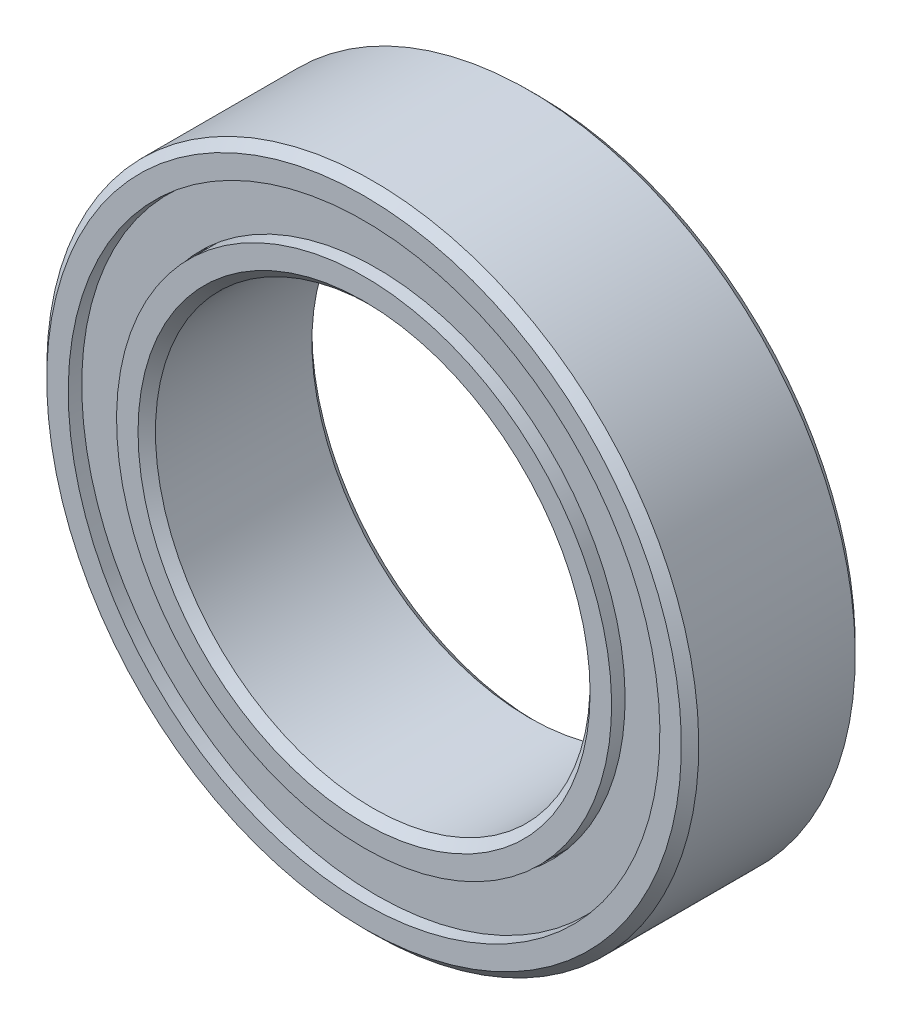
ISO-10303-21;
HEADER;
FILE_DESCRIPTION(('STEP AP214'),'2;1');
FILE_NAME('part.step','',(''),(''),'','','');
FILE_SCHEMA(('AUTOMOTIVE_DESIGN { 1 0 10303 214 1 1 1 1 }'));
ENDSEC;
DATA;
#1=APPLICATION_CONTEXT('core data for automotive mechanical design processes');
#2=APPLICATION_PROTOCOL_DEFINITION('international standard','automotive_design',2000,#1);
#3=PRODUCT_CONTEXT('',#1,'mechanical');
#4=PRODUCT('Part','Part','',(#3));
#5=PRODUCT_RELATED_PRODUCT_CATEGORY('part','',(#4));
#6=PRODUCT_DEFINITION_FORMATION('','',#4);
#7=PRODUCT_DEFINITION_CONTEXT('part definition',#1,'design');
#8=PRODUCT_DEFINITION('design','',#6,#7);
#9=PRODUCT_DEFINITION_SHAPE('','',#8);
#10=(LENGTH_UNIT() NAMED_UNIT(*) SI_UNIT(.MILLI.,.METRE.));
#11=(NAMED_UNIT(*) PLANE_ANGLE_UNIT() SI_UNIT($,.RADIAN.));
#12=(NAMED_UNIT(*) SI_UNIT($,.STERADIAN.) SOLID_ANGLE_UNIT());
#13=UNCERTAINTY_MEASURE_WITH_UNIT(LENGTH_MEASURE(1.E-05),#10,'distance_accuracy_value','');
#14=(GEOMETRIC_REPRESENTATION_CONTEXT(3) GLOBAL_UNCERTAINTY_ASSIGNED_CONTEXT((#13)) GLOBAL_UNIT_ASSIGNED_CONTEXT((#10,
#11,#12)) REPRESENTATION_CONTEXT('',''));
#15=CARTESIAN_POINT('',(0.,0.,0.));
#16=DIRECTION('',(0.,0.,1.));
#17=DIRECTION('',(1.,0.,0.));
#18=AXIS2_PLACEMENT_3D('',#15,#16,#17);
#19=CARTESIAN_POINT('',(3.37900510909742,5.25783458019492,0.));
#20=DIRECTION('',(0.,0.,1.));
#21=DIRECTION('',(0.540640817455587,0.841253532831188,0.));
#22=AXIS2_PLACEMENT_3D('',#19,#20,#21);
#23=SPHERICAL_SURFACE('',#22,1.04822012578407);
#24=CARTESIAN_POINT('',(3.37900510909742,5.25783458019492,1.04822012578406));
#25=VERTEX_POINT('',#24);
#26=VERTEX_LOOP('',#25);
#27=FACE_BOUND('',#26,.T.);
#28=ADVANCED_FACE('F46',(#27),#23,.T.);
#29=CLOSED_SHELL('',(#28));
#30=MANIFOLD_SOLID_BREP('B2',#29);
#31=CARTESIAN_POINT('',(5.68519997096571,2.59634383126185,0.));
#32=DIRECTION('',(0.,0.,1.));
#33=DIRECTION('',(0.909631995354514,0.415415013001897,0.));
#34=AXIS2_PLACEMENT_3D('',#31,#32,#33);
#35=SPHERICAL_SURFACE('',#34,1.04822012578407);
#36=CARTESIAN_POINT('',(5.68519997096571,2.59634383126185,1.04822012578406));
#37=VERTEX_POINT('',#36);
#38=VERTEX_LOOP('',#37);
#39=FACE_BOUND('',#38,.T.);
#40=ADVANCED_FACE('F66',(#39),#35,.T.);
#41=CLOSED_SHELL('',(#40));
#42=MANIFOLD_SOLID_BREP('B6',#41);
#43=CARTESIAN_POINT('',(6.18638401175584,-0.889467739207972,0.));
#44=DIRECTION('',(0.,0.,1.));
#45=DIRECTION('',(0.989821441880934,-0.142314838273276,0.));
#46=AXIS2_PLACEMENT_3D('',#43,#44,#45);
#47=SPHERICAL_SURFACE('',#46,1.04822012578407);
#48=CARTESIAN_POINT('',(6.18638401175584,-0.889467739207972,1.04822012578406));
#49=VERTEX_POINT('',#48);
#50=VERTEX_LOOP('',#49);
#51=FACE_BOUND('',#50,.T.);
#52=ADVANCED_FACE('F85',(#51),#47,.T.);
#53=CLOSED_SHELL('',(#52));
#54=MANIFOLD_SOLID_BREP('B42',#53);
#55=CARTESIAN_POINT('',(4.72343483971415,-4.09287958715799,0.));
#56=DIRECTION('',(0.,0.,1.));
#57=DIRECTION('',(0.755749574354264,-0.654860733945279,0.));
#58=AXIS2_PLACEMENT_3D('',#55,#56,#57);
#59=SPHERICAL_SURFACE('',#58,1.04822012578407);
#60=CARTESIAN_POINT('',(4.72343483971415,-4.09287958715799,1.04822012578406));
#61=VERTEX_POINT('',#60);
#62=VERTEX_LOOP('',#61);
#63=FACE_BOUND('',#62,.T.);
#64=ADVANCED_FACE('F105',(#63),#59,.T.);
#65=CLOSED_SHELL('',(#64));
#66=MANIFOLD_SOLID_BREP('B62',#65);
#67=CARTESIAN_POINT('',(1.76082848025898,-5.99683108509059,0.));
#68=DIRECTION('',(0.,0.,1.));
#69=DIRECTION('',(0.281732556841437,-0.959492973614495,0.));
#70=AXIS2_PLACEMENT_3D('',#67,#68,#69);
#71=SPHERICAL_SURFACE('',#70,1.04822012578407);
#72=CARTESIAN_POINT('',(1.76082848025898,-5.99683108509059,1.04822012578406));
#73=VERTEX_POINT('',#72);
#74=VERTEX_LOOP('',#73);
#75=FACE_BOUND('',#74,.T.);
#76=ADVANCED_FACE('F125',(#75),#71,.T.);
#77=CLOSED_SHELL('',(#76));
#78=MANIFOLD_SOLID_BREP('B81',#77);
#79=CARTESIAN_POINT('',(-1.7608284802589,-5.99683108509062,0.));
#80=DIRECTION('',(0.,0.,1.));
#81=DIRECTION('',(-0.281732556841424,-0.959492973614499,0.));
#82=AXIS2_PLACEMENT_3D('',#79,#80,#81);
#83=SPHERICAL_SURFACE('',#82,1.04822012578407);
#84=CARTESIAN_POINT('',(-1.7608284802589,-5.99683108509062,1.04822012578406));
#85=VERTEX_POINT('',#84);
#86=VERTEX_LOOP('',#85);
#87=FACE_BOUND('',#86,.T.);
#88=ADVANCED_FACE('F144',(#87),#83,.T.);
#89=CLOSED_SHELL('',(#88));
#90=MANIFOLD_SOLID_BREP('B101',#89);
#91=CARTESIAN_POINT('',(-4.72343483971409,-4.09287958715805,0.));
#92=DIRECTION('',(0.,0.,1.));
#93=DIRECTION('',(-0.755749574354255,-0.654860733945289,0.));
#94=AXIS2_PLACEMENT_3D('',#91,#92,#93);
#95=SPHERICAL_SURFACE('',#94,1.04822012578407);
#96=CARTESIAN_POINT('',(-4.72343483971409,-4.09287958715805,1.04822012578406));
#97=VERTEX_POINT('',#96);
#98=VERTEX_LOOP('',#97);
#99=FACE_BOUND('',#98,.T.);
#100=ADVANCED_FACE('F163',(#99),#95,.T.);
#101=CLOSED_SHELL('',(#100));
#102=MANIFOLD_SOLID_BREP('B121',#101);
#103=CARTESIAN_POINT('',(-6.18638401175583,-0.889467739208054,0.));
#104=DIRECTION('',(0.,0.,1.));
#105=DIRECTION('',(-0.989821441880932,-0.142314838273289,0.));
#106=AXIS2_PLACEMENT_3D('',#103,#104,#105);
#107=SPHERICAL_SURFACE('',#106,1.04822012578407);
#108=CARTESIAN_POINT('',(-6.18638401175583,-0.889467739208054,1.04822012578406));
#109=VERTEX_POINT('',#108);
#110=VERTEX_LOOP('',#109);
#111=FACE_BOUND('',#110,.T.);
#112=ADVANCED_FACE('F182',(#111),#107,.T.);
#113=CLOSED_SHELL('',(#112));
#114=MANIFOLD_SOLID_BREP('B140',#113);
#115=CARTESIAN_POINT('',(-5.68519997096575,2.59634383126178,0.));
#116=DIRECTION('',(0.,0.,1.));
#117=DIRECTION('',(-0.90963199535452,0.415415013001884,0.));
#118=AXIS2_PLACEMENT_3D('',#115,#116,#117);
#119=SPHERICAL_SURFACE('',#118,1.04822012578407);
#120=CARTESIAN_POINT('',(-5.68519997096575,2.59634383126178,1.04822012578406));
#121=VERTEX_POINT('',#120);
#122=VERTEX_LOOP('',#121);
#123=FACE_BOUND('',#122,.T.);
#124=ADVANCED_FACE('F202',(#123),#119,.T.);
#125=CLOSED_SHELL('',(#124));
#126=MANIFOLD_SOLID_BREP('B159',#125);
#127=CARTESIAN_POINT('',(-3.37900510909749,5.25783458019488,0.));
#128=DIRECTION('',(0.,0.,1.));
#129=DIRECTION('',(-0.540640817455599,0.841253532831181,0.));
#130=AXIS2_PLACEMENT_3D('',#127,#128,#129);
#131=SPHERICAL_SURFACE('',#130,1.04822012578407);
#132=CARTESIAN_POINT('',(-3.37900510909749,5.25783458019488,1.04822012578406));
#133=VERTEX_POINT('',#132);
#134=VERTEX_LOOP('',#133);
#135=FACE_BOUND('',#134,.T.);
#136=ADVANCED_FACE('F222',(#135),#131,.T.);
#137=CLOSED_SHELL('',(#136));
#138=MANIFOLD_SOLID_BREP('B178',#137);
#139=CARTESIAN_POINT('',(0.,6.25,0.));
#140=DIRECTION('',(0.,0.,1.));
#141=DIRECTION('',(0.,1.,0.));
#142=AXIS2_PLACEMENT_3D('',#139,#140,#141);
#143=SPHERICAL_SURFACE('',#142,1.04822012578407);
#144=CARTESIAN_POINT('',(0.,6.25,1.04822012578406));
#145=VERTEX_POINT('',#144);
#146=VERTEX_LOOP('',#145);
#147=FACE_BOUND('',#146,.T.);
#148=ADVANCED_FACE('F243',(#147),#143,.T.);
#149=CLOSED_SHELL('',(#148));
#150=MANIFOLD_SOLID_BREP('B198',#149);
#151=CARTESIAN_POINT('',(0.,5.69444444444443,2.00000000000003));
#152=DIRECTION('',(0.,0.,-1.));
#153=DIRECTION('',(0.,1.,0.));
#154=AXIS2_PLACEMENT_3D('',#151,#152,#153);
#155=PLANE('',#154);
#156=CARTESIAN_POINT('',(0.,0.,2.00000000000003));
#157=DIRECTION('',(0.,0.,1.));
#158=DIRECTION('',(0.,-1.,0.));
#159=AXIS2_PLACEMENT_3D('',#156,#157,#158);
#160=CIRCLE('',#159,5.19999999999999);
#161=CARTESIAN_POINT('',(0.,-5.19999999999999,2.00000000000003));
#162=VERTEX_POINT('',#161);
#163=EDGE_CURVE('E299',#162,#162,#160,.T.);
#164=ORIENTED_EDGE('',*,*,#163,.F.);
#165=EDGE_LOOP('',(#164));
#166=FACE_BOUND('',#165,.T.);
#167=CARTESIAN_POINT('',(0.,0.,2.00000000000003));
#168=DIRECTION('',(0.,0.,1.));
#169=DIRECTION('',(0.,-1.,0.));
#170=AXIS2_PLACEMENT_3D('',#167,#168,#169);
#171=CIRCLE('',#170,5.69444444444443);
#172=CARTESIAN_POINT('',(0.,-5.69444444444443,2.00000000000003));
#173=VERTEX_POINT('',#172);
#174=EDGE_CURVE('E242',#173,#173,#171,.T.);
#175=ORIENTED_EDGE('',*,*,#174,.T.);
#176=EDGE_LOOP('',(#175));
#177=FACE_BOUND('',#176,.T.);
#178=ADVANCED_FACE('F263',(#166,#177),#155,.F.);
#179=CARTESIAN_POINT('',(0.,0.,2.00000000000002));
#180=DIRECTION('',(0.,0.,1.));
#181=DIRECTION('',(0.,-1.,0.));
#182=AXIS2_PLACEMENT_3D('',#179,#180,#181);
#183=CYLINDRICAL_SURFACE('',#182,5.69444444444443);
#184=ORIENTED_EDGE('',*,*,#174,.F.);
#185=EDGE_LOOP('',(#184));
#186=FACE_BOUND('',#185,.T.);
#187=CARTESIAN_POINT('',(0.,0.,0.888888888888882));
#188=DIRECTION('',(0.,0.,1.));
#189=DIRECTION('',(0.,-1.,0.));
#190=AXIS2_PLACEMENT_3D('',#187,#188,#189);
#191=CIRCLE('',#190,5.69444444444443);
#192=CARTESIAN_POINT('',(0.,-5.69444444444443,0.888888888888882));
#193=VERTEX_POINT('',#192);
#194=EDGE_CURVE('E270',#193,#193,#191,.T.);
#195=ORIENTED_EDGE('',*,*,#194,.T.);
#196=EDGE_LOOP('',(#195));
#197=FACE_BOUND('',#196,.T.);
#198=ADVANCED_FACE('F306',(#186,#197),#183,.T.);
#199=CARTESIAN_POINT('',(0.,0.,0.));
#200=DIRECTION('',(0.,0.,1.));
#201=DIRECTION('',(0.,-1.,0.));
#202=AXIS2_PLACEMENT_3D('',#199,#200,#201);
#203=TOROIDAL_SURFACE('',#202,6.24999999999999,1.04822012578407);
#204=ORIENTED_EDGE('',*,*,#194,.F.);
#205=EDGE_LOOP('',(#204));
#206=FACE_BOUND('',#205,.T.);
#207=CARTESIAN_POINT('',(0.,0.,-0.888888888888884));
#208=DIRECTION('',(0.,0.,1.));
#209=DIRECTION('',(0.,-1.,0.));
#210=AXIS2_PLACEMENT_3D('',#207,#208,#209);
#211=CIRCLE('',#210,5.69444444444443);
#212=CARTESIAN_POINT('',(0.,-5.69444444444443,-0.888888888888885));
#213=VERTEX_POINT('',#212);
#214=EDGE_CURVE('E276',#213,#213,#211,.T.);
#215=ORIENTED_EDGE('',*,*,#214,.T.);
#216=EDGE_LOOP('',(#215));
#217=FACE_BOUND('',#216,.T.);
#218=ADVANCED_FACE('F310',(#206,#217),#203,.F.);
#219=CARTESIAN_POINT('',(0.,0.,2.00000000000002));
#220=DIRECTION('',(0.,0.,1.));
#221=DIRECTION('',(0.,-1.,0.));
#222=AXIS2_PLACEMENT_3D('',#219,#220,#221);
#223=CYLINDRICAL_SURFACE('',#222,5.69444444444443);
#224=ORIENTED_EDGE('',*,*,#214,.F.);
#225=EDGE_LOOP('',(#224));
#226=FACE_BOUND('',#225,.T.);
#227=CARTESIAN_POINT('',(0.,0.,-2.00000000000003));
#228=DIRECTION('',(0.,0.,1.));
#229=DIRECTION('',(0.,-1.,0.));
#230=AXIS2_PLACEMENT_3D('',#227,#228,#229);
#231=CIRCLE('',#230,5.69444444444443);
#232=CARTESIAN_POINT('',(0.,-5.69444444444442,-2.00000000000003));
#233=VERTEX_POINT('',#232);
#234=EDGE_CURVE('E282',#233,#233,#231,.T.);
#235=ORIENTED_EDGE('',*,*,#234,.T.);
#236=EDGE_LOOP('',(#235));
#237=FACE_BOUND('',#236,.T.);
#238=ADVANCED_FACE('F315',(#226,#237),#223,.T.);
#239=CARTESIAN_POINT('',(0.,5.2,-2.00000000000003));
#240=DIRECTION('',(0.,0.,1.));
#241=DIRECTION('',(0.,-1.,0.));
#242=AXIS2_PLACEMENT_3D('',#239,#240,#241);
#243=PLANE('',#242);
#244=ORIENTED_EDGE('',*,*,#234,.F.);
#245=EDGE_LOOP('',(#244));
#246=FACE_BOUND('',#245,.T.);
#247=CARTESIAN_POINT('',(0.,0.,-2.00000000000003));
#248=DIRECTION('',(0.,0.,1.));
#249=DIRECTION('',(0.,-1.,0.));
#250=AXIS2_PLACEMENT_3D('',#247,#248,#249);
#251=CIRCLE('',#250,5.2);
#252=CARTESIAN_POINT('',(0.,-5.2,-2.00000000000004));
#253=VERTEX_POINT('',#252);
#254=EDGE_CURVE('E288',#253,#253,#251,.T.);
#255=ORIENTED_EDGE('',*,*,#254,.T.);
#256=EDGE_LOOP('',(#255));
#257=FACE_BOUND('',#256,.T.);
#258=ADVANCED_FACE('F320',(#246,#257),#243,.F.);
#259=CARTESIAN_POINT('',(0.,0.,-1.80000000000003));
#260=DIRECTION('',(0.,0.,-1.));
#261=DIRECTION('',(0.,1.,0.));
#262=AXIS2_PLACEMENT_3D('',#259,#260,#261);
#263=CONICAL_SURFACE('',#262,4.99999999999999,0.785398163397475);
#264=ORIENTED_EDGE('',*,*,#254,.F.);
#265=EDGE_LOOP('',(#264));
#266=FACE_BOUND('',#265,.T.);
#267=CARTESIAN_POINT('',(0.,0.,-1.80000000000003));
#268=DIRECTION('',(0.,0.,1.));
#269=DIRECTION('',(0.,-1.,0.));
#270=AXIS2_PLACEMENT_3D('',#267,#268,#269);
#271=CIRCLE('',#270,4.99999999999999);
#272=CARTESIAN_POINT('',(0.,-4.99999999999999,-1.80000000000003));
#273=VERTEX_POINT('',#272);
#274=EDGE_CURVE('E292',#273,#273,#271,.T.);
#275=ORIENTED_EDGE('',*,*,#274,.T.);
#276=EDGE_LOOP('',(#275));
#277=FACE_BOUND('',#276,.T.);
#278=ADVANCED_FACE('F324',(#266,#277),#263,.F.);
#279=CARTESIAN_POINT('',(0.,0.,2.00000000000002));
#280=DIRECTION('',(0.,0.,1.));
#281=DIRECTION('',(0.,-1.,0.));
#282=AXIS2_PLACEMENT_3D('',#279,#280,#281);
#283=CYLINDRICAL_SURFACE('',#282,4.99999999999999);
#284=ORIENTED_EDGE('',*,*,#274,.F.);
#285=EDGE_LOOP('',(#284));
#286=FACE_BOUND('',#285,.T.);
#287=CARTESIAN_POINT('',(0.,0.,1.80000000000002));
#288=DIRECTION('',(0.,0.,1.));
#289=DIRECTION('',(0.,-1.,0.));
#290=AXIS2_PLACEMENT_3D('',#287,#288,#289);
#291=CIRCLE('',#290,5.);
#292=CARTESIAN_POINT('',(0.,-5.,1.80000000000001));
#293=VERTEX_POINT('',#292);
#294=EDGE_CURVE('E295',#293,#293,#291,.T.);
#295=ORIENTED_EDGE('',*,*,#294,.T.);
#296=EDGE_LOOP('',(#295));
#297=FACE_BOUND('',#296,.T.);
#298=ADVANCED_FACE('F327',(#286,#297),#283,.F.);
#299=CARTESIAN_POINT('',(0.,0.,2.00000000000003));
#300=DIRECTION('',(0.,0.,1.));
#301=DIRECTION('',(0.,-1.,0.));
#302=AXIS2_PLACEMENT_3D('',#299,#300,#301);
#303=CONICAL_SURFACE('',#302,5.19999999999999,0.785398163397398);
#304=ORIENTED_EDGE('',*,*,#294,.F.);
#305=EDGE_LOOP('',(#304));
#306=FACE_BOUND('',#305,.T.);
#307=ORIENTED_EDGE('',*,*,#163,.T.);
#308=EDGE_LOOP('',(#307));
#309=FACE_BOUND('',#308,.T.);
#310=ADVANCED_FACE('F303',(#306,#309),#303,.F.);
#311=CLOSED_SHELL('',(#178,#198,#218,#238,#258,#278,#298,#310));
#312=MANIFOLD_SOLID_BREP('B218',#311);
#313=CARTESIAN_POINT('',(0.,5.71984444444445,-1.33361006289205));
#314=DIRECTION('',(0.,0.,-1.));
#315=DIRECTION('',(0.,1.,0.));
#316=AXIS2_PLACEMENT_3D('',#313,#314,#315);
#317=PLANE('',#316);
#318=CARTESIAN_POINT('',(0.,0.,-1.33361006289205));
#319=DIRECTION('',(0.,0.,1.));
#320=DIRECTION('',(0.,-1.,0.));
#321=AXIS2_PLACEMENT_3D('',#318,#319,#320);
#322=CIRCLE('',#321,5.71984444444445);
#323=CARTESIAN_POINT('',(0.,-5.71984444444445,-1.33361006289205));
#324=VERTEX_POINT('',#323);
#325=EDGE_CURVE('E410',#324,#324,#322,.T.);
#326=ORIENTED_EDGE('',*,*,#325,.F.);
#327=EDGE_LOOP('',(#326));
#328=FACE_BOUND('',#327,.T.);
#329=CARTESIAN_POINT('',(0.,0.,-1.33361006289205));
#330=DIRECTION('',(0.,0.,1.));
#331=DIRECTION('',(0.,-1.,0.));
#332=AXIS2_PLACEMENT_3D('',#329,#330,#331);
#333=CIRCLE('',#332,6.78015555555556);
#334=CARTESIAN_POINT('',(0.,-6.78015555555556,-1.33361006289205));
#335=VERTEX_POINT('',#334);
#336=EDGE_CURVE('E262',#335,#335,#333,.T.);
#337=ORIENTED_EDGE('',*,*,#336,.T.);
#338=EDGE_LOOP('',(#337));
#339=FACE_BOUND('',#338,.T.);
#340=ADVANCED_FACE('F392',(#328,#339),#317,.F.);
#341=CARTESIAN_POINT('',(0.,0.,2.00000000000002));
#342=DIRECTION('',(0.,0.,1.));
#343=DIRECTION('',(0.,-1.,0.));
#344=AXIS2_PLACEMENT_3D('',#341,#342,#343);
#345=CYLINDRICAL_SURFACE('',#344,6.78015555555556);
#346=ORIENTED_EDGE('',*,*,#336,.F.);
#347=EDGE_LOOP('',(#346));
#348=FACE_BOUND('',#347,.T.);
#349=CARTESIAN_POINT('',(0.,0.,-1.71461006289205));
#350=DIRECTION('',(0.,0.,1.));
#351=DIRECTION('',(0.,-1.,0.));
#352=AXIS2_PLACEMENT_3D('',#349,#350,#351);
#353=CIRCLE('',#352,6.78015555555556);
#354=CARTESIAN_POINT('',(0.,-6.78015555555555,-1.71461006289205));
#355=VERTEX_POINT('',#354);
#356=EDGE_CURVE('E399',#355,#355,#353,.T.);
#357=ORIENTED_EDGE('',*,*,#356,.T.);
#358=EDGE_LOOP('',(#357));
#359=FACE_BOUND('',#358,.T.);
#360=ADVANCED_FACE('F419',(#348,#359),#345,.T.);
#361=CARTESIAN_POINT('',(0.,5.71984444444445,-1.71461006289205));
#362=DIRECTION('',(0.,0.,1.));
#363=DIRECTION('',(0.,-1.,0.));
#364=AXIS2_PLACEMENT_3D('',#361,#362,#363);
#365=PLANE('',#364);
#366=ORIENTED_EDGE('',*,*,#356,.F.);
#367=EDGE_LOOP('',(#366));
#368=FACE_BOUND('',#367,.T.);
#369=CARTESIAN_POINT('',(0.,0.,-1.71461006289205));
#370=DIRECTION('',(0.,0.,1.));
#371=DIRECTION('',(0.,-1.,0.));
#372=AXIS2_PLACEMENT_3D('',#369,#370,#371);
#373=CIRCLE('',#372,5.71984444444445);
#374=CARTESIAN_POINT('',(0.,-5.71984444444445,-1.71461006289205));
#375=VERTEX_POINT('',#374);
#376=EDGE_CURVE('E405',#375,#375,#373,.T.);
#377=ORIENTED_EDGE('',*,*,#376,.T.);
#378=EDGE_LOOP('',(#377));
#379=FACE_BOUND('',#378,.T.);
#380=ADVANCED_FACE('F422',(#368,#379),#365,.F.);
#381=CARTESIAN_POINT('',(0.,0.,2.00000000000002));
#382=DIRECTION('',(0.,0.,1.));
#383=DIRECTION('',(0.,-1.,0.));
#384=AXIS2_PLACEMENT_3D('',#381,#382,#383);
#385=CYLINDRICAL_SURFACE('',#384,5.71984444444445);
#386=ORIENTED_EDGE('',*,*,#376,.F.);
#387=EDGE_LOOP('',(#386));
#388=FACE_BOUND('',#387,.T.);
#389=ORIENTED_EDGE('',*,*,#325,.T.);
#390=EDGE_LOOP('',(#389));
#391=FACE_BOUND('',#390,.T.);
#392=ADVANCED_FACE('F416',(#388,#391),#385,.F.);
#393=CLOSED_SHELL('',(#340,#360,#380,#392));
#394=MANIFOLD_SOLID_BREP('B237',#393);
#395=CARTESIAN_POINT('',(0.,5.71984444444445,1.71461006289204));
#396=DIRECTION('',(0.,0.,-1.));
#397=DIRECTION('',(0.,1.,0.));
#398=AXIS2_PLACEMENT_3D('',#395,#396,#397);
#399=PLANE('',#398);
#400=CARTESIAN_POINT('',(0.,0.,1.71461006289204));
#401=DIRECTION('',(0.,0.,1.));
#402=DIRECTION('',(0.,-1.,0.));
#403=AXIS2_PLACEMENT_3D('',#400,#401,#402);
#404=CIRCLE('',#403,5.71984444444445);
#405=CARTESIAN_POINT('',(0.,-5.71984444444445,1.71461006289204));
#406=VERTEX_POINT('',#405);
#407=EDGE_CURVE('E391',#406,#406,#404,.T.);
#408=ORIENTED_EDGE('',*,*,#407,.F.);
#409=EDGE_LOOP('',(#408));
#410=FACE_BOUND('',#409,.T.);
#411=CARTESIAN_POINT('',(0.,0.,1.71461006289204));
#412=DIRECTION('',(0.,0.,1.));
#413=DIRECTION('',(0.,-1.,0.));
#414=AXIS2_PLACEMENT_3D('',#411,#412,#413);
#415=CIRCLE('',#414,6.78015555555556);
#416=CARTESIAN_POINT('',(0.,-6.78015555555556,1.71461006289204));
#417=VERTEX_POINT('',#416);
#418=EDGE_CURVE('E478',#417,#417,#415,.T.);
#419=ORIENTED_EDGE('',*,*,#418,.T.);
#420=EDGE_LOOP('',(#419));
#421=FACE_BOUND('',#420,.T.);
#422=ADVANCED_FACE('F460',(#410,#421),#399,.F.);
#423=CARTESIAN_POINT('',(0.,0.,2.00000000000002));
#424=DIRECTION('',(0.,0.,1.));
#425=DIRECTION('',(0.,-1.,0.));
#426=AXIS2_PLACEMENT_3D('',#423,#424,#425);
#427=CYLINDRICAL_SURFACE('',#426,5.71984444444445);
#428=CARTESIAN_POINT('',(0.,0.,1.33361006289204));
#429=DIRECTION('',(0.,0.,1.));
#430=DIRECTION('',(0.,-1.,0.));
#431=AXIS2_PLACEMENT_3D('',#428,#429,#430);
#432=CIRCLE('',#431,5.71984444444445);
#433=CARTESIAN_POINT('',(0.,-5.71984444444445,1.33361006289204));
#434=VERTEX_POINT('',#433);
#435=EDGE_CURVE('E467',#434,#434,#432,.T.);
#436=ORIENTED_EDGE('',*,*,#435,.F.);
#437=EDGE_LOOP('',(#436));
#438=FACE_BOUND('',#437,.T.);
#439=ORIENTED_EDGE('',*,*,#407,.T.);
#440=EDGE_LOOP('',(#439));
#441=FACE_BOUND('',#440,.T.);
#442=ADVANCED_FACE('F493',(#438,#441),#427,.F.);
#443=CARTESIAN_POINT('',(0.,5.71984444444445,1.33361006289204));
#444=DIRECTION('',(0.,0.,1.));
#445=DIRECTION('',(0.,-1.,0.));
#446=AXIS2_PLACEMENT_3D('',#443,#444,#445);
#447=PLANE('',#446);
#448=CARTESIAN_POINT('',(0.,0.,1.33361006289204));
#449=DIRECTION('',(0.,0.,1.));
#450=DIRECTION('',(0.,-1.,0.));
#451=AXIS2_PLACEMENT_3D('',#448,#449,#450);
#452=CIRCLE('',#451,6.78015555555556);
#453=CARTESIAN_POINT('',(0.,-6.78015555555556,1.33361006289204));
#454=VERTEX_POINT('',#453);
#455=EDGE_CURVE('E472',#454,#454,#452,.T.);
#456=ORIENTED_EDGE('',*,*,#455,.F.);
#457=EDGE_LOOP('',(#456));
#458=FACE_BOUND('',#457,.T.);
#459=ORIENTED_EDGE('',*,*,#435,.T.);
#460=EDGE_LOOP('',(#459));
#461=FACE_BOUND('',#460,.T.);
#462=ADVANCED_FACE('F488',(#458,#461),#447,.F.);
#463=CARTESIAN_POINT('',(0.,0.,2.00000000000002));
#464=DIRECTION('',(0.,0.,1.));
#465=DIRECTION('',(0.,-1.,0.));
#466=AXIS2_PLACEMENT_3D('',#463,#464,#465);
#467=CYLINDRICAL_SURFACE('',#466,6.78015555555556);
#468=ORIENTED_EDGE('',*,*,#418,.F.);
#469=EDGE_LOOP('',(#468));
#470=FACE_BOUND('',#469,.T.);
#471=ORIENTED_EDGE('',*,*,#455,.T.);
#472=EDGE_LOOP('',(#471));
#473=FACE_BOUND('',#472,.T.);
#474=ADVANCED_FACE('F485',(#470,#473),#467,.T.);
#475=CLOSED_SHELL('',(#422,#442,#462,#474));
#476=MANIFOLD_SOLID_BREP('B257',#475);
#477=CARTESIAN_POINT('',(0.,0.,1.80000000000002));
#478=DIRECTION('',(0.,0.,-1.));
#479=DIRECTION('',(0.,1.,0.));
#480=AXIS2_PLACEMENT_3D('',#477,#478,#479);
#481=CONICAL_SURFACE('',#480,7.49999999999999,0.785398163397463);
#482=CARTESIAN_POINT('',(0.,0.,2.00000000000002));
#483=DIRECTION('',(0.,0.,1.));
#484=DIRECTION('',(0.,-1.,0.));
#485=AXIS2_PLACEMENT_3D('',#482,#483,#484);
#486=CIRCLE('',#485,7.29999999999999);
#487=CARTESIAN_POINT('',(0.,-7.29999999999999,2.00000000000002));
#488=VERTEX_POINT('',#487);
#489=EDGE_CURVE('E557',#488,#488,#486,.T.);
#490=ORIENTED_EDGE('',*,*,#489,.F.);
#491=EDGE_LOOP('',(#490));
#492=FACE_BOUND('',#491,.T.);
#493=CARTESIAN_POINT('',(0.,0.,1.80000000000002));
#494=DIRECTION('',(0.,0.,1.));
#495=DIRECTION('',(0.,-1.,0.));
#496=AXIS2_PLACEMENT_3D('',#493,#494,#495);
#497=CIRCLE('',#496,7.49999999999999);
#498=CARTESIAN_POINT('',(0.,-7.49999999999999,1.80000000000002));
#499=VERTEX_POINT('',#498);
#500=EDGE_CURVE('E459',#499,#499,#497,.T.);
#501=ORIENTED_EDGE('',*,*,#500,.T.);
#502=EDGE_LOOP('',(#501));
#503=FACE_BOUND('',#502,.T.);
#504=ADVANCED_FACE('F521',(#492,#503),#481,.T.);
#505=CARTESIAN_POINT('',(0.,0.,2.00000000000002));
#506=DIRECTION('',(0.,0.,1.));
#507=DIRECTION('',(0.,-1.,0.));
#508=AXIS2_PLACEMENT_3D('',#505,#506,#507);
#509=CYLINDRICAL_SURFACE('',#508,7.49999999999999);
#510=ORIENTED_EDGE('',*,*,#500,.F.);
#511=EDGE_LOOP('',(#510));
#512=FACE_BOUND('',#511,.T.);
#513=CARTESIAN_POINT('',(0.,0.,-1.80000000000003));
#514=DIRECTION('',(0.,0.,1.));
#515=DIRECTION('',(0.,-1.,0.));
#516=AXIS2_PLACEMENT_3D('',#513,#514,#515);
#517=CIRCLE('',#516,7.49999999999999);
#518=CARTESIAN_POINT('',(0.,-7.49999999999999,-1.80000000000003));
#519=VERTEX_POINT('',#518);
#520=EDGE_CURVE('E528',#519,#519,#517,.T.);
#521=ORIENTED_EDGE('',*,*,#520,.T.);
#522=EDGE_LOOP('',(#521));
#523=FACE_BOUND('',#522,.T.);
#524=ADVANCED_FACE('F564',(#512,#523),#509,.T.);
#525=CARTESIAN_POINT('',(0.,0.,-2.00000000000003));
#526=DIRECTION('',(0.,0.,1.));
#527=DIRECTION('',(0.,-1.,0.));
#528=AXIS2_PLACEMENT_3D('',#525,#526,#527);
#529=CONICAL_SURFACE('',#528,7.29999999999999,0.785398163397463);
#530=ORIENTED_EDGE('',*,*,#520,.F.);
#531=EDGE_LOOP('',(#530));
#532=FACE_BOUND('',#531,.T.);
#533=CARTESIAN_POINT('',(0.,0.,-2.00000000000003));
#534=DIRECTION('',(0.,0.,1.));
#535=DIRECTION('',(0.,-1.,0.));
#536=AXIS2_PLACEMENT_3D('',#533,#534,#535);
#537=CIRCLE('',#536,7.29999999999999);
#538=CARTESIAN_POINT('',(0.,-7.29999999999999,-2.00000000000003));
#539=VERTEX_POINT('',#538);
#540=EDGE_CURVE('E535',#539,#539,#537,.T.);
#541=ORIENTED_EDGE('',*,*,#540,.T.);
#542=EDGE_LOOP('',(#541));
#543=FACE_BOUND('',#542,.T.);
#544=ADVANCED_FACE('F569',(#532,#543),#529,.T.);
#545=CARTESIAN_POINT('',(0.,7.29999999999999,-2.00000000000003));
#546=DIRECTION('',(0.,0.,1.));
#547=DIRECTION('',(0.,-1.,0.));
#548=AXIS2_PLACEMENT_3D('',#545,#546,#547);
#549=PLANE('',#548);
#550=ORIENTED_EDGE('',*,*,#540,.F.);
#551=EDGE_LOOP('',(#550));
#552=FACE_BOUND('',#551,.T.);
#553=CARTESIAN_POINT('',(0.,0.,-2.00000000000003));
#554=DIRECTION('',(0.,0.,1.));
#555=DIRECTION('',(0.,-1.,0.));
#556=AXIS2_PLACEMENT_3D('',#553,#554,#555);
#557=CIRCLE('',#556,6.80555555555555);
#558=CARTESIAN_POINT('',(0.,-6.80555555555555,-2.00000000000003));
#559=VERTEX_POINT('',#558);
#560=EDGE_CURVE('E541',#559,#559,#557,.T.);
#561=ORIENTED_EDGE('',*,*,#560,.T.);
#562=EDGE_LOOP('',(#561));
#563=FACE_BOUND('',#562,.T.);
#564=ADVANCED_FACE('F574',(#552,#563),#549,.F.);
#565=CARTESIAN_POINT('',(0.,0.,2.00000000000002));
#566=DIRECTION('',(0.,0.,1.));
#567=DIRECTION('',(0.,-1.,0.));
#568=AXIS2_PLACEMENT_3D('',#565,#566,#567);
#569=CYLINDRICAL_SURFACE('',#568,6.80555555555555);
#570=ORIENTED_EDGE('',*,*,#560,.F.);
#571=EDGE_LOOP('',(#570));
#572=FACE_BOUND('',#571,.T.);
#573=CARTESIAN_POINT('',(0.,0.,-0.888888888888897));
#574=DIRECTION('',(0.,0.,1.));
#575=DIRECTION('',(0.,-1.,0.));
#576=AXIS2_PLACEMENT_3D('',#573,#574,#575);
#577=CIRCLE('',#576,6.80555555555555);
#578=CARTESIAN_POINT('',(0.,-6.80555555555555,-0.888888888888897));
#579=VERTEX_POINT('',#578);
#580=EDGE_CURVE('E547',#579,#579,#577,.T.);
#581=ORIENTED_EDGE('',*,*,#580,.T.);
#582=EDGE_LOOP('',(#581));
#583=FACE_BOUND('',#582,.T.);
#584=ADVANCED_FACE('F580',(#572,#583),#569,.F.);
#585=CARTESIAN_POINT('',(0.,0.,0.));
#586=DIRECTION('',(0.,0.,1.));
#587=DIRECTION('',(0.,-1.,0.));
#588=AXIS2_PLACEMENT_3D('',#585,#586,#587);
#589=TOROIDAL_SURFACE('',#588,6.25,1.04822012578407);
#590=ORIENTED_EDGE('',*,*,#580,.F.);
#591=EDGE_LOOP('',(#590));
#592=FACE_BOUND('',#591,.T.);
#593=CARTESIAN_POINT('',(0.,0.,0.888888888888883));
#594=DIRECTION('',(0.,0.,1.));
#595=DIRECTION('',(0.,-1.,0.));
#596=AXIS2_PLACEMENT_3D('',#593,#594,#595);
#597=CIRCLE('',#596,6.80555555555555);
#598=CARTESIAN_POINT('',(0.,-6.80555555555555,0.888888888888882));
#599=VERTEX_POINT('',#598);
#600=EDGE_CURVE('E550',#599,#599,#597,.T.);
#601=ORIENTED_EDGE('',*,*,#600,.T.);
#602=EDGE_LOOP('',(#601));
#603=FACE_BOUND('',#602,.T.);
#604=ADVANCED_FACE('F584',(#592,#603),#589,.F.);
#605=CARTESIAN_POINT('',(0.,0.,2.00000000000002));
#606=DIRECTION('',(0.,0.,1.));
#607=DIRECTION('',(0.,-1.,0.));
#608=AXIS2_PLACEMENT_3D('',#605,#606,#607);
#609=CYLINDRICAL_SURFACE('',#608,6.80555555555555);
#610=ORIENTED_EDGE('',*,*,#600,.F.);
#611=EDGE_LOOP('',(#610));
#612=FACE_BOUND('',#611,.T.);
#613=CARTESIAN_POINT('',(0.,0.,2.00000000000001));
#614=DIRECTION('',(0.,0.,1.));
#615=DIRECTION('',(0.,-1.,0.));
#616=AXIS2_PLACEMENT_3D('',#613,#614,#615);
#617=CIRCLE('',#616,6.80555555555555);
#618=CARTESIAN_POINT('',(0.,-6.80555555555555,2.00000000000001));
#619=VERTEX_POINT('',#618);
#620=EDGE_CURVE('E554',#619,#619,#617,.T.);
#621=ORIENTED_EDGE('',*,*,#620,.T.);
#622=EDGE_LOOP('',(#621));
#623=FACE_BOUND('',#622,.T.);
#624=ADVANCED_FACE('F587',(#612,#623),#609,.F.);
#625=CARTESIAN_POINT('',(0.,7.29999999999999,2.00000000000002));
#626=DIRECTION('',(0.,0.,-1.));
#627=DIRECTION('',(0.,1.,0.));
#628=AXIS2_PLACEMENT_3D('',#625,#626,#627);
#629=PLANE('',#628);
#630=ORIENTED_EDGE('',*,*,#620,.F.);
#631=EDGE_LOOP('',(#630));
#632=FACE_BOUND('',#631,.T.);
#633=ORIENTED_EDGE('',*,*,#489,.T.);
#634=EDGE_LOOP('',(#633));
#635=FACE_BOUND('',#634,.T.);
#636=ADVANCED_FACE('F561',(#632,#635),#629,.F.);
#637=CLOSED_SHELL('',(#504,#524,#544,#564,#584,#604,#624,#636));
#638=MANIFOLD_SOLID_BREP('B386',#637);
#639=ADVANCED_BREP_SHAPE_REPRESENTATION('',(#18,#30,#42,#54,#66,#78,#90,#102,#114,#126,#138,
#150,#312,#394,#476,#638),#14);
#640=SHAPE_DEFINITION_REPRESENTATION(#9,#639);
ENDSEC;
END-ISO-10303-21;
